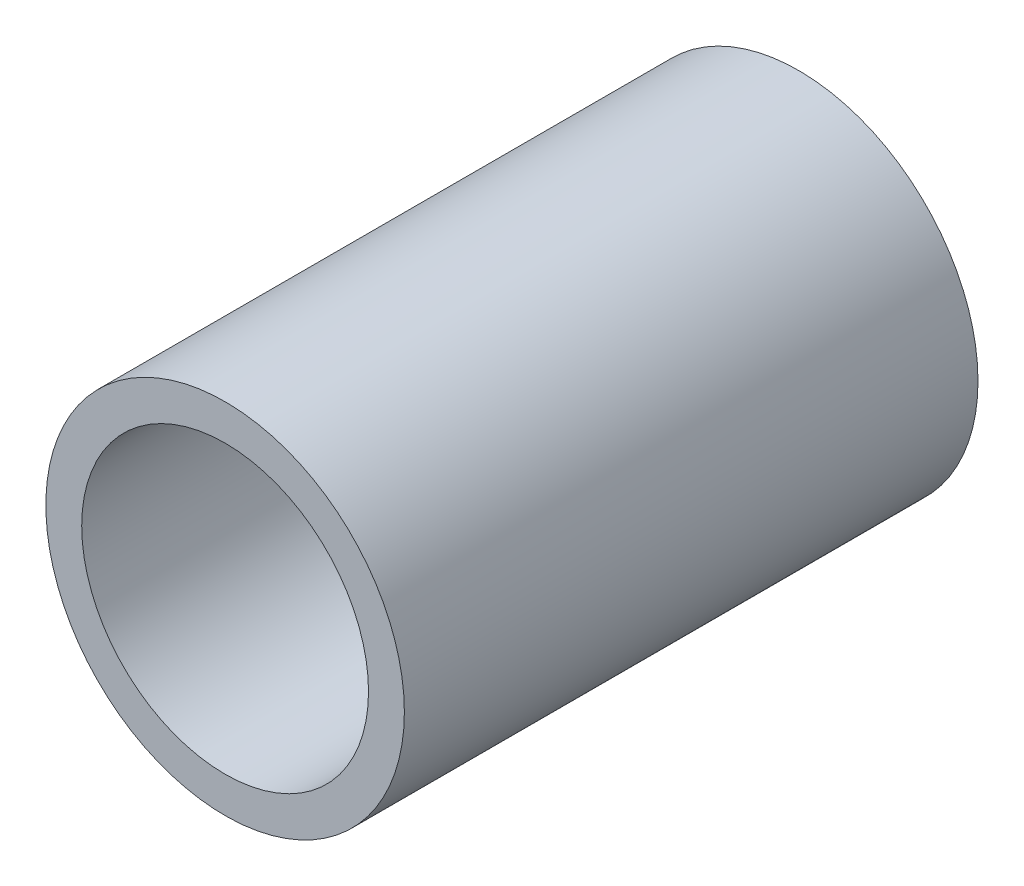
ISO-10303-21;
HEADER;
FILE_DESCRIPTION(('STEP AP214'),'2;1');
FILE_NAME('part.step','',(''),(''),'','','');
FILE_SCHEMA(('AUTOMOTIVE_DESIGN { 1 0 10303 214 1 1 1 1 }'));
ENDSEC;
DATA;
#1=APPLICATION_CONTEXT('core data for automotive mechanical design processes');
#2=APPLICATION_PROTOCOL_DEFINITION('international standard','automotive_design',2000,#1);
#3=PRODUCT_CONTEXT('',#1,'mechanical');
#4=PRODUCT('Part','Part','',(#3));
#5=PRODUCT_RELATED_PRODUCT_CATEGORY('part','',(#4));
#6=PRODUCT_DEFINITION_FORMATION('','',#4);
#7=PRODUCT_DEFINITION_CONTEXT('part definition',#1,'design');
#8=PRODUCT_DEFINITION('design','',#6,#7);
#9=PRODUCT_DEFINITION_SHAPE('','',#8);
#10=(LENGTH_UNIT() NAMED_UNIT(*) SI_UNIT(.MILLI.,.METRE.));
#11=(NAMED_UNIT(*) PLANE_ANGLE_UNIT() SI_UNIT($,.RADIAN.));
#12=(NAMED_UNIT(*) SI_UNIT($,.STERADIAN.) SOLID_ANGLE_UNIT());
#13=UNCERTAINTY_MEASURE_WITH_UNIT(LENGTH_MEASURE(1.E-05),#10,'distance_accuracy_value','');
#14=(GEOMETRIC_REPRESENTATION_CONTEXT(3) GLOBAL_UNCERTAINTY_ASSIGNED_CONTEXT((#13)) GLOBAL_UNIT_ASSIGNED_CONTEXT((#10,
#11,#12)) REPRESENTATION_CONTEXT('',''));
#15=CARTESIAN_POINT('',(0.,0.,0.));
#16=DIRECTION('',(0.,0.,1.));
#17=DIRECTION('',(1.,0.,0.));
#18=AXIS2_PLACEMENT_3D('',#15,#16,#17);
#19=CARTESIAN_POINT('',(0.,0.,25.4));
#20=DIRECTION('',(0.,0.,1.));
#21=DIRECTION('',(1.,0.,0.));
#22=AXIS2_PLACEMENT_3D('',#19,#20,#21);
#23=PLANE('',#22);
#24=CARTESIAN_POINT('',(0.,0.,25.4));
#25=DIRECTION('',(0.,0.,1.));
#26=DIRECTION('',(1.,0.,0.));
#27=AXIS2_PLACEMENT_3D('',#24,#25,#26);
#28=CIRCLE('',#27,7.9375);
#29=CARTESIAN_POINT('',(7.9375,0.,25.4));
#30=VERTEX_POINT('',#29);
#31=EDGE_CURVE('E10',#30,#30,#28,.T.);
#32=ORIENTED_EDGE('',*,*,#31,.T.);
#33=EDGE_LOOP('',(#32));
#34=FACE_BOUND('',#33,.T.);
#35=CARTESIAN_POINT('',(0.,0.,25.4));
#36=DIRECTION('',(0.,0.,1.));
#37=DIRECTION('',(1.,0.,0.));
#38=AXIS2_PLACEMENT_3D('',#35,#36,#37);
#39=CIRCLE('',#38,6.35);
#40=CARTESIAN_POINT('',(6.35,0.,25.4));
#41=VERTEX_POINT('',#40);
#42=EDGE_CURVE('E41',#41,#41,#39,.T.);
#43=ORIENTED_EDGE('',*,*,#42,.F.);
#44=EDGE_LOOP('',(#43));
#45=FACE_BOUND('',#44,.T.);
#46=ADVANCED_FACE('F30',(#34,#45),#23,.T.);
#47=CARTESIAN_POINT('',(0.,0.,0.));
#48=DIRECTION('',(0.,0.,1.));
#49=DIRECTION('',(1.,0.,0.));
#50=AXIS2_PLACEMENT_3D('',#47,#48,#49);
#51=PLANE('',#50);
#52=CARTESIAN_POINT('',(0.,0.,0.));
#53=DIRECTION('',(0.,0.,1.));
#54=DIRECTION('',(1.,0.,0.));
#55=AXIS2_PLACEMENT_3D('',#52,#53,#54);
#56=CIRCLE('',#55,7.9375);
#57=CARTESIAN_POINT('',(7.9375,0.,0.));
#58=VERTEX_POINT('',#57);
#59=EDGE_CURVE('E34',#58,#58,#56,.T.);
#60=ORIENTED_EDGE('',*,*,#59,.F.);
#61=EDGE_LOOP('',(#60));
#62=FACE_BOUND('',#61,.T.);
#63=CARTESIAN_POINT('',(0.,0.,0.));
#64=DIRECTION('',(0.,0.,1.));
#65=DIRECTION('',(1.,0.,0.));
#66=AXIS2_PLACEMENT_3D('',#63,#64,#65);
#67=CIRCLE('',#66,6.35);
#68=CARTESIAN_POINT('',(6.35,0.,0.));
#69=VERTEX_POINT('',#68);
#70=EDGE_CURVE('E43',#69,#69,#67,.T.);
#71=ORIENTED_EDGE('',*,*,#70,.T.);
#72=EDGE_LOOP('',(#71));
#73=FACE_BOUND('',#72,.T.);
#74=ADVANCED_FACE('F53',(#62,#73),#51,.F.);
#75=CARTESIAN_POINT('',(0.,0.,25.4));
#76=DIRECTION('',(0.,0.,-1.));
#77=DIRECTION('',(-1.,0.,0.));
#78=AXIS2_PLACEMENT_3D('',#75,#76,#77);
#79=CYLINDRICAL_SURFACE('',#78,7.9375);
#80=ORIENTED_EDGE('',*,*,#31,.F.);
#81=EDGE_LOOP('',(#80));
#82=FACE_BOUND('',#81,.T.);
#83=ORIENTED_EDGE('',*,*,#59,.T.);
#84=EDGE_LOOP('',(#83));
#85=FACE_BOUND('',#84,.T.);
#86=ADVANCED_FACE('F32',(#82,#85),#79,.T.);
#87=CARTESIAN_POINT('',(0.,0.,25.4));
#88=DIRECTION('',(0.,0.,-1.));
#89=DIRECTION('',(-1.,0.,0.));
#90=AXIS2_PLACEMENT_3D('',#87,#88,#89);
#91=CYLINDRICAL_SURFACE('',#90,6.35);
#92=ORIENTED_EDGE('',*,*,#42,.T.);
#93=EDGE_LOOP('',(#92));
#94=FACE_BOUND('',#93,.T.);
#95=ORIENTED_EDGE('',*,*,#70,.F.);
#96=EDGE_LOOP('',(#95));
#97=FACE_BOUND('',#96,.T.);
#98=ADVANCED_FACE('F49',(#94,#97),#91,.F.);
#99=CLOSED_SHELL('',(#46,#74,#86,#98));
#100=MANIFOLD_SOLID_BREP('B2',#99);
#101=ADVANCED_BREP_SHAPE_REPRESENTATION('',(#18,#100),#14);
#102=SHAPE_DEFINITION_REPRESENTATION(#9,#101);
ENDSEC;
END-ISO-10303-21;
